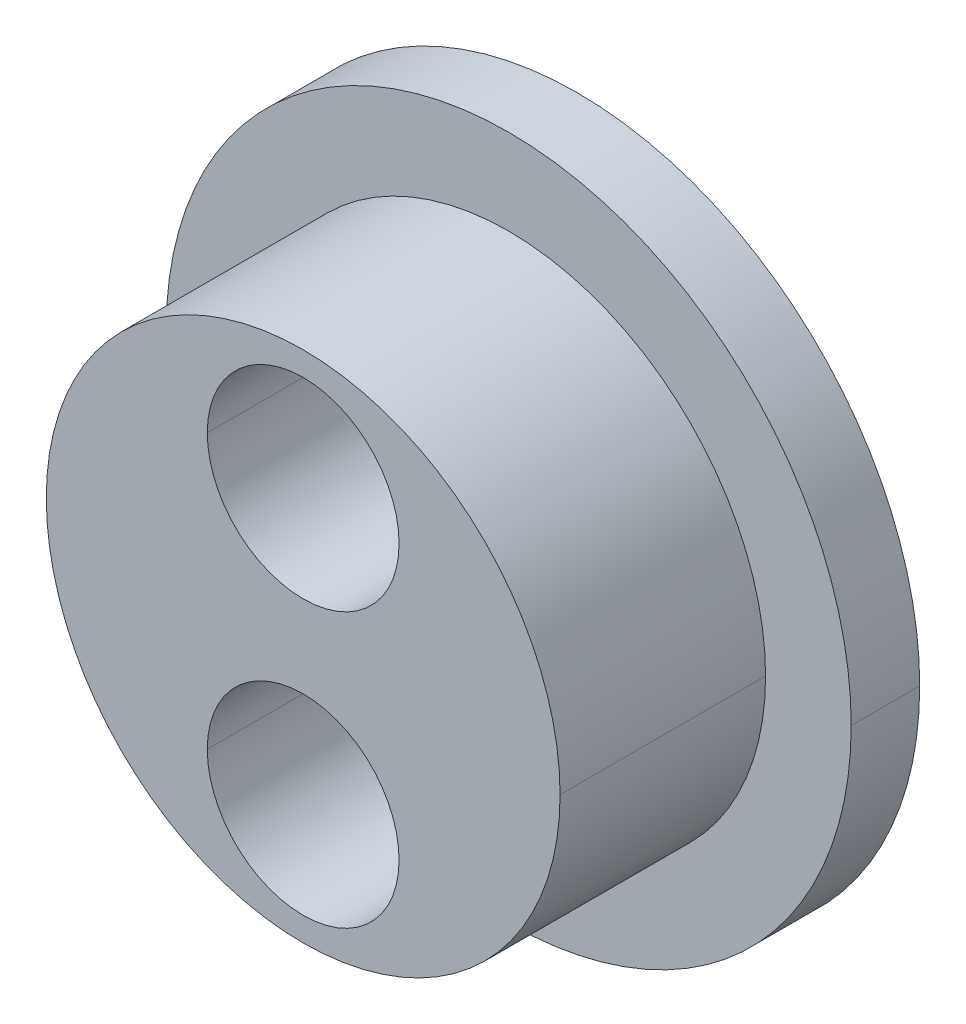
ISO-10303-21;
HEADER;
FILE_DESCRIPTION(('STEP AP214'),'2;1');
FILE_NAME('part.step','',(''),(''),'','','');
FILE_SCHEMA(('AUTOMOTIVE_DESIGN { 1 0 10303 214 1 1 1 1 }'));
ENDSEC;
DATA;
#1=APPLICATION_CONTEXT('core data for automotive mechanical design processes');
#2=APPLICATION_PROTOCOL_DEFINITION('international standard','automotive_design',2000,#1);
#3=PRODUCT_CONTEXT('',#1,'mechanical');
#4=PRODUCT('Part','Part','',(#3));
#5=PRODUCT_RELATED_PRODUCT_CATEGORY('part','',(#4));
#6=PRODUCT_DEFINITION_FORMATION('','',#4);
#7=PRODUCT_DEFINITION_CONTEXT('part definition',#1,'design');
#8=PRODUCT_DEFINITION('design','',#6,#7);
#9=PRODUCT_DEFINITION_SHAPE('','',#8);
#10=(LENGTH_UNIT() NAMED_UNIT(*) SI_UNIT(.MILLI.,.METRE.));
#11=(NAMED_UNIT(*) PLANE_ANGLE_UNIT() SI_UNIT($,.RADIAN.));
#12=(NAMED_UNIT(*) SI_UNIT($,.STERADIAN.) SOLID_ANGLE_UNIT());
#13=UNCERTAINTY_MEASURE_WITH_UNIT(LENGTH_MEASURE(1.E-05),#10,'distance_accuracy_value','');
#14=(GEOMETRIC_REPRESENTATION_CONTEXT(3) GLOBAL_UNCERTAINTY_ASSIGNED_CONTEXT((#13)) GLOBAL_UNIT_ASSIGNED_CONTEXT((#10,
#11,#12)) REPRESENTATION_CONTEXT('',''));
#15=CARTESIAN_POINT('',(0.,0.,0.));
#16=DIRECTION('',(0.,0.,1.));
#17=DIRECTION('',(1.,0.,0.));
#18=AXIS2_PLACEMENT_3D('',#15,#16,#17);
#19=CARTESIAN_POINT('',(0.,-4.,4.));
#20=DIRECTION('',(0.,0.,1.));
#21=DIRECTION('',(1.,0.,0.));
#22=AXIS2_PLACEMENT_3D('',#19,#20,#21);
#23=CYLINDRICAL_SURFACE('',#22,2.8);
#24=DIRECTION('',(0.,0.,1.));
#25=VECTOR('',#24,1.);
#26=CARTESIAN_POINT('',(-2.8,-4.,4.));
#27=LINE('',#26,#25);
#28=CARTESIAN_POINT('',(-2.8,-4.,4.));
#29=VERTEX_POINT('',#28);
#30=CARTESIAN_POINT('',(-2.8,-4.,8.));
#31=VERTEX_POINT('',#30);
#32=EDGE_CURVE('E277',#29,#31,#27,.T.);
#33=ORIENTED_EDGE('',*,*,#32,.F.);
#34=CARTESIAN_POINT('',(0.,-4.,4.));
#35=DIRECTION('',(0.,0.,1.));
#36=DIRECTION('',(1.,0.,0.));
#37=AXIS2_PLACEMENT_3D('',#34,#35,#36);
#38=CIRCLE('',#37,2.8);
#39=CARTESIAN_POINT('',(2.8,-4.,4.));
#40=VERTEX_POINT('',#39);
#41=EDGE_CURVE('E11',#40,#29,#38,.T.);
#42=ORIENTED_EDGE('',*,*,#41,.F.);
#43=DIRECTION('',(0.,0.,1.));
#44=VECTOR('',#43,1.);
#45=CARTESIAN_POINT('',(2.8,-4.,4.));
#46=LINE('',#45,#44);
#47=CARTESIAN_POINT('',(2.8,-4.,8.));
#48=VERTEX_POINT('',#47);
#49=EDGE_CURVE('E284',#40,#48,#46,.T.);
#50=ORIENTED_EDGE('',*,*,#49,.T.);
#51=CARTESIAN_POINT('',(0.,-4.,8.));
#52=DIRECTION('',(0.,0.,1.));
#53=DIRECTION('',(1.,0.,0.));
#54=AXIS2_PLACEMENT_3D('',#51,#52,#53);
#55=CIRCLE('',#54,2.8);
#56=EDGE_CURVE('E237',#48,#31,#55,.T.);
#57=ORIENTED_EDGE('',*,*,#56,.T.);
#58=EDGE_LOOP('',(#33,#42,#50,#57));
#59=FACE_BOUND('',#58,.T.);
#60=ADVANCED_FACE('F17',(#59),#23,.F.);
#61=CARTESIAN_POINT('',(0.,-4.,4.));
#62=DIRECTION('',(0.,0.,1.));
#63=DIRECTION('',(1.,0.,0.));
#64=AXIS2_PLACEMENT_3D('',#61,#62,#63);
#65=PLANE('',#64);
#66=CARTESIAN_POINT('',(0.,-4.,4.));
#67=DIRECTION('',(0.,0.,-1.));
#68=DIRECTION('',(1.,0.,0.));
#69=AXIS2_PLACEMENT_3D('',#66,#67,#68);
#70=CIRCLE('',#69,1.35);
#71=CARTESIAN_POINT('',(1.35,-4.,4.));
#72=VERTEX_POINT('',#71);
#73=CARTESIAN_POINT('',(-1.35,-4.,4.));
#74=VERTEX_POINT('',#73);
#75=EDGE_CURVE('E223',#72,#74,#70,.T.);
#76=ORIENTED_EDGE('',*,*,#75,.T.);
#77=CARTESIAN_POINT('',(0.,-4.,4.));
#78=DIRECTION('',(0.,0.,-1.));
#79=DIRECTION('',(1.,0.,0.));
#80=AXIS2_PLACEMENT_3D('',#77,#78,#79);
#81=CIRCLE('',#80,1.35);
#82=EDGE_CURVE('E38',#74,#72,#81,.T.);
#83=ORIENTED_EDGE('',*,*,#82,.T.);
#84=EDGE_LOOP('',(#76,#83));
#85=FACE_BOUND('',#84,.T.);
#86=ORIENTED_EDGE('',*,*,#41,.T.);
#87=CARTESIAN_POINT('',(0.,-4.,4.));
#88=DIRECTION('',(0.,0.,1.));
#89=DIRECTION('',(1.,0.,0.));
#90=AXIS2_PLACEMENT_3D('',#87,#88,#89);
#91=CIRCLE('',#90,2.8);
#92=EDGE_CURVE('E274',#29,#40,#91,.T.);
#93=ORIENTED_EDGE('',*,*,#92,.T.);
#94=EDGE_LOOP('',(#86,#93));
#95=FACE_BOUND('',#94,.T.);
#96=ADVANCED_FACE('F19',(#85,#95),#65,.T.);
#97=CARTESIAN_POINT('',(0.,4.,4.));
#98=DIRECTION('',(0.,0.,1.));
#99=DIRECTION('',(1.,0.,0.));
#100=AXIS2_PLACEMENT_3D('',#97,#98,#99);
#101=CYLINDRICAL_SURFACE('',#100,2.8);
#102=DIRECTION('',(0.,0.,1.));
#103=VECTOR('',#102,1.);
#104=CARTESIAN_POINT('',(-2.8,4.,4.));
#105=LINE('',#104,#103);
#106=CARTESIAN_POINT('',(-2.8,4.,4.));
#107=VERTEX_POINT('',#106);
#108=CARTESIAN_POINT('',(-2.8,4.,8.));
#109=VERTEX_POINT('',#108);
#110=EDGE_CURVE('E258',#107,#109,#105,.T.);
#111=ORIENTED_EDGE('',*,*,#110,.F.);
#112=CARTESIAN_POINT('',(0.,4.,4.));
#113=DIRECTION('',(0.,0.,1.));
#114=DIRECTION('',(1.,0.,0.));
#115=AXIS2_PLACEMENT_3D('',#112,#113,#114);
#116=CIRCLE('',#115,2.8);
#117=CARTESIAN_POINT('',(2.8,4.,4.));
#118=VERTEX_POINT('',#117);
#119=EDGE_CURVE('E26',#118,#107,#116,.T.);
#120=ORIENTED_EDGE('',*,*,#119,.F.);
#121=DIRECTION('',(0.,0.,1.));
#122=VECTOR('',#121,1.);
#123=CARTESIAN_POINT('',(2.8,4.,4.));
#124=LINE('',#123,#122);
#125=CARTESIAN_POINT('',(2.8,4.,8.));
#126=VERTEX_POINT('',#125);
#127=EDGE_CURVE('E175',#118,#126,#124,.T.);
#128=ORIENTED_EDGE('',*,*,#127,.T.);
#129=CARTESIAN_POINT('',(0.,4.,8.));
#130=DIRECTION('',(0.,0.,1.));
#131=DIRECTION('',(1.,0.,0.));
#132=AXIS2_PLACEMENT_3D('',#129,#130,#131);
#133=CIRCLE('',#132,2.8);
#134=EDGE_CURVE('E216',#126,#109,#133,.T.);
#135=ORIENTED_EDGE('',*,*,#134,.T.);
#136=EDGE_LOOP('',(#111,#120,#128,#135));
#137=FACE_BOUND('',#136,.T.);
#138=ADVANCED_FACE('F271',(#137),#101,.F.);
#139=CARTESIAN_POINT('',(0.,4.,4.));
#140=DIRECTION('',(0.,0.,1.));
#141=DIRECTION('',(1.,0.,0.));
#142=AXIS2_PLACEMENT_3D('',#139,#140,#141);
#143=PLANE('',#142);
#144=CARTESIAN_POINT('',(0.,4.,4.));
#145=DIRECTION('',(0.,0.,-1.));
#146=DIRECTION('',(1.,0.,0.));
#147=AXIS2_PLACEMENT_3D('',#144,#145,#146);
#148=CIRCLE('',#147,1.35);
#149=CARTESIAN_POINT('',(1.35,4.,4.));
#150=VERTEX_POINT('',#149);
#151=CARTESIAN_POINT('',(-1.35,4.,4.));
#152=VERTEX_POINT('',#151);
#153=EDGE_CURVE('E204',#150,#152,#148,.T.);
#154=ORIENTED_EDGE('',*,*,#153,.T.);
#155=CARTESIAN_POINT('',(0.,4.,4.));
#156=DIRECTION('',(0.,0.,-1.));
#157=DIRECTION('',(1.,0.,0.));
#158=AXIS2_PLACEMENT_3D('',#155,#156,#157);
#159=CIRCLE('',#158,1.35);
#160=EDGE_CURVE('E229',#152,#150,#159,.T.);
#161=ORIENTED_EDGE('',*,*,#160,.T.);
#162=EDGE_LOOP('',(#154,#161));
#163=FACE_BOUND('',#162,.T.);
#164=ORIENTED_EDGE('',*,*,#119,.T.);
#165=CARTESIAN_POINT('',(0.,4.,4.));
#166=DIRECTION('',(0.,0.,1.));
#167=DIRECTION('',(1.,0.,0.));
#168=AXIS2_PLACEMENT_3D('',#165,#166,#167);
#169=CIRCLE('',#168,2.8);
#170=EDGE_CURVE('E256',#107,#118,#169,.T.);
#171=ORIENTED_EDGE('',*,*,#170,.T.);
#172=EDGE_LOOP('',(#164,#171));
#173=FACE_BOUND('',#172,.T.);
#174=ADVANCED_FACE('F304',(#163,#173),#143,.T.);
#175=CARTESIAN_POINT('',(0.,0.,8.));
#176=DIRECTION('',(0.,0.,1.));
#177=DIRECTION('',(1.,0.,0.));
#178=AXIS2_PLACEMENT_3D('',#175,#176,#177);
#179=PLANE('',#178);
#180=ORIENTED_EDGE('',*,*,#56,.F.);
#181=CARTESIAN_POINT('',(0.,-4.,8.));
#182=DIRECTION('',(0.,0.,1.));
#183=DIRECTION('',(1.,0.,0.));
#184=AXIS2_PLACEMENT_3D('',#181,#182,#183);
#185=CIRCLE('',#184,2.8);
#186=EDGE_CURVE('E281',#31,#48,#185,.T.);
#187=ORIENTED_EDGE('',*,*,#186,.F.);
#188=EDGE_LOOP('',(#180,#187));
#189=FACE_BOUND('',#188,.T.);
#190=ORIENTED_EDGE('',*,*,#134,.F.);
#191=CARTESIAN_POINT('',(0.,4.,8.));
#192=DIRECTION('',(0.,0.,1.));
#193=DIRECTION('',(1.,0.,0.));
#194=AXIS2_PLACEMENT_3D('',#191,#192,#193);
#195=CIRCLE('',#194,2.8);
#196=EDGE_CURVE('E170',#109,#126,#195,.T.);
#197=ORIENTED_EDGE('',*,*,#196,.F.);
#198=EDGE_LOOP('',(#190,#197));
#199=FACE_BOUND('',#198,.T.);
#200=CARTESIAN_POINT('',(0.,0.,8.));
#201=DIRECTION('',(0.,0.,1.));
#202=DIRECTION('',(1.,0.,0.));
#203=AXIS2_PLACEMENT_3D('',#200,#201,#202);
#204=CIRCLE('',#203,7.5);
#205=CARTESIAN_POINT('',(-7.5,0.,8.));
#206=VERTEX_POINT('',#205);
#207=CARTESIAN_POINT('',(7.5,0.,8.));
#208=VERTEX_POINT('',#207);
#209=EDGE_CURVE('E213',#206,#208,#204,.T.);
#210=ORIENTED_EDGE('',*,*,#209,.T.);
#211=CARTESIAN_POINT('',(0.,0.,8.));
#212=DIRECTION('',(0.,0.,1.));
#213=DIRECTION('',(1.,0.,0.));
#214=AXIS2_PLACEMENT_3D('',#211,#212,#213);
#215=CIRCLE('',#214,7.5);
#216=EDGE_CURVE('E179',#208,#206,#215,.T.);
#217=ORIENTED_EDGE('',*,*,#216,.T.);
#218=EDGE_LOOP('',(#210,#217));
#219=FACE_BOUND('',#218,.T.);
#220=ADVANCED_FACE('F300',(#189,#199,#219),#179,.T.);
#221=CARTESIAN_POINT('',(0.,0.,8.));
#222=DIRECTION('',(0.,0.,-1.));
#223=DIRECTION('',(-1.,0.,0.));
#224=AXIS2_PLACEMENT_3D('',#221,#222,#223);
#225=CYLINDRICAL_SURFACE('',#224,7.5);
#226=DIRECTION('',(0.,0.,-1.));
#227=VECTOR('',#226,1.);
#228=CARTESIAN_POINT('',(7.5,0.,8.));
#229=LINE('',#228,#227);
#230=CARTESIAN_POINT('',(7.5,0.,2.));
#231=VERTEX_POINT('',#230);
#232=EDGE_CURVE('E186',#208,#231,#229,.T.);
#233=ORIENTED_EDGE('',*,*,#232,.F.);
#234=ORIENTED_EDGE('',*,*,#209,.F.);
#235=DIRECTION('',(0.,0.,-1.));
#236=VECTOR('',#235,1.);
#237=CARTESIAN_POINT('',(-7.5,0.,8.));
#238=LINE('',#237,#236);
#239=CARTESIAN_POINT('',(-7.5,0.,2.));
#240=VERTEX_POINT('',#239);
#241=EDGE_CURVE('E185',#206,#240,#238,.T.);
#242=ORIENTED_EDGE('',*,*,#241,.T.);
#243=CARTESIAN_POINT('',(0.,0.,2.));
#244=DIRECTION('',(0.,0.,1.));
#245=DIRECTION('',(1.,0.,0.));
#246=AXIS2_PLACEMENT_3D('',#243,#244,#245);
#247=CIRCLE('',#246,7.5);
#248=EDGE_CURVE('E145',#240,#231,#247,.T.);
#249=ORIENTED_EDGE('',*,*,#248,.T.);
#250=EDGE_LOOP('',(#233,#234,#242,#249));
#251=FACE_BOUND('',#250,.T.);
#252=ADVANCED_FACE('F303',(#251),#225,.T.);
#253=CARTESIAN_POINT('',(0.,0.,0.));
#254=DIRECTION('',(0.,0.,1.));
#255=DIRECTION('',(1.,0.,0.));
#256=AXIS2_PLACEMENT_3D('',#253,#254,#255);
#257=PLANE('',#256);
#258=CARTESIAN_POINT('',(0.,-4.,0.));
#259=DIRECTION('',(0.,0.,1.));
#260=DIRECTION('',(1.,0.,0.));
#261=AXIS2_PLACEMENT_3D('',#258,#259,#260);
#262=CIRCLE('',#261,1.35);
#263=CARTESIAN_POINT('',(1.35,-4.,0.));
#264=VERTEX_POINT('',#263);
#265=CARTESIAN_POINT('',(-1.35,-4.,0.));
#266=VERTEX_POINT('',#265);
#267=EDGE_CURVE('E172',#264,#266,#262,.T.);
#268=ORIENTED_EDGE('',*,*,#267,.T.);
#269=CARTESIAN_POINT('',(0.,-4.,0.));
#270=DIRECTION('',(0.,0.,1.));
#271=DIRECTION('',(1.,0.,0.));
#272=AXIS2_PLACEMENT_3D('',#269,#270,#271);
#273=CIRCLE('',#272,1.35);
#274=EDGE_CURVE('E212',#266,#264,#273,.T.);
#275=ORIENTED_EDGE('',*,*,#274,.T.);
#276=EDGE_LOOP('',(#268,#275));
#277=FACE_BOUND('',#276,.T.);
#278=CARTESIAN_POINT('',(0.,4.,0.));
#279=DIRECTION('',(0.,0.,1.));
#280=DIRECTION('',(1.,0.,0.));
#281=AXIS2_PLACEMENT_3D('',#278,#279,#280);
#282=CIRCLE('',#281,1.35);
#283=CARTESIAN_POINT('',(1.35,4.,0.));
#284=VERTEX_POINT('',#283);
#285=CARTESIAN_POINT('',(-1.35,4.,0.));
#286=VERTEX_POINT('',#285);
#287=EDGE_CURVE('E182',#284,#286,#282,.T.);
#288=ORIENTED_EDGE('',*,*,#287,.T.);
#289=CARTESIAN_POINT('',(0.,4.,0.));
#290=DIRECTION('',(0.,0.,1.));
#291=DIRECTION('',(1.,0.,0.));
#292=AXIS2_PLACEMENT_3D('',#289,#290,#291);
#293=CIRCLE('',#292,1.35);
#294=EDGE_CURVE('E155',#286,#284,#293,.T.);
#295=ORIENTED_EDGE('',*,*,#294,.T.);
#296=EDGE_LOOP('',(#288,#295));
#297=FACE_BOUND('',#296,.T.);
#298=CARTESIAN_POINT('',(0.,0.,0.));
#299=DIRECTION('',(0.,0.,1.));
#300=DIRECTION('',(1.,0.,0.));
#301=AXIS2_PLACEMENT_3D('',#298,#299,#300);
#302=CIRCLE('',#301,10.);
#303=CARTESIAN_POINT('',(-10.,0.,0.));
#304=VERTEX_POINT('',#303);
#305=CARTESIAN_POINT('',(10.,0.,0.));
#306=VERTEX_POINT('',#305);
#307=EDGE_CURVE('E136',#304,#306,#302,.T.);
#308=ORIENTED_EDGE('',*,*,#307,.F.);
#309=CARTESIAN_POINT('',(0.,0.,0.));
#310=DIRECTION('',(0.,0.,1.));
#311=DIRECTION('',(1.,0.,0.));
#312=AXIS2_PLACEMENT_3D('',#309,#310,#311);
#313=CIRCLE('',#312,10.);
#314=EDGE_CURVE('E140',#306,#304,#313,.T.);
#315=ORIENTED_EDGE('',*,*,#314,.F.);
#316=EDGE_LOOP('',(#308,#315));
#317=FACE_BOUND('',#316,.T.);
#318=ADVANCED_FACE('F138',(#277,#297,#317),#257,.F.);
#319=CARTESIAN_POINT('',(0.,0.,2.));
#320=DIRECTION('',(0.,0.,1.));
#321=DIRECTION('',(1.,0.,0.));
#322=AXIS2_PLACEMENT_3D('',#319,#320,#321);
#323=PLANE('',#322);
#324=ORIENTED_EDGE('',*,*,#248,.F.);
#325=CARTESIAN_POINT('',(0.,0.,2.));
#326=DIRECTION('',(0.,0.,1.));
#327=DIRECTION('',(1.,0.,0.));
#328=AXIS2_PLACEMENT_3D('',#325,#326,#327);
#329=CIRCLE('',#328,7.5);
#330=EDGE_CURVE('E190',#231,#240,#329,.T.);
#331=ORIENTED_EDGE('',*,*,#330,.F.);
#332=EDGE_LOOP('',(#324,#331));
#333=FACE_BOUND('',#332,.T.);
#334=CARTESIAN_POINT('',(0.,0.,2.));
#335=DIRECTION('',(0.,0.,1.));
#336=DIRECTION('',(1.,0.,0.));
#337=AXIS2_PLACEMENT_3D('',#334,#335,#336);
#338=CIRCLE('',#337,10.);
#339=CARTESIAN_POINT('',(-10.,0.,2.));
#340=VERTEX_POINT('',#339);
#341=CARTESIAN_POINT('',(10.,0.,2.));
#342=VERTEX_POINT('',#341);
#343=EDGE_CURVE('E146',#340,#342,#338,.T.);
#344=ORIENTED_EDGE('',*,*,#343,.T.);
#345=CARTESIAN_POINT('',(0.,0.,2.));
#346=DIRECTION('',(0.,0.,1.));
#347=DIRECTION('',(1.,0.,0.));
#348=AXIS2_PLACEMENT_3D('',#345,#346,#347);
#349=CIRCLE('',#348,10.);
#350=EDGE_CURVE('E166',#342,#340,#349,.T.);
#351=ORIENTED_EDGE('',*,*,#350,.T.);
#352=EDGE_LOOP('',(#344,#351));
#353=FACE_BOUND('',#352,.T.);
#354=ADVANCED_FACE('F316',(#333,#353),#323,.T.);
#355=CARTESIAN_POINT('',(0.,0.,2.));
#356=DIRECTION('',(0.,0.,-1.));
#357=DIRECTION('',(-1.,0.,0.));
#358=AXIS2_PLACEMENT_3D('',#355,#356,#357);
#359=CYLINDRICAL_SURFACE('',#358,10.);
#360=DIRECTION('',(0.,0.,-1.));
#361=VECTOR('',#360,1.);
#362=CARTESIAN_POINT('',(10.,0.,2.));
#363=LINE('',#362,#361);
#364=EDGE_CURVE('E158',#342,#306,#363,.T.);
#365=ORIENTED_EDGE('',*,*,#364,.F.);
#366=ORIENTED_EDGE('',*,*,#343,.F.);
#367=DIRECTION('',(0.,0.,-1.));
#368=VECTOR('',#367,1.);
#369=CARTESIAN_POINT('',(-10.,0.,2.));
#370=LINE('',#369,#368);
#371=EDGE_CURVE('E149',#340,#304,#370,.T.);
#372=ORIENTED_EDGE('',*,*,#371,.T.);
#373=ORIENTED_EDGE('',*,*,#307,.T.);
#374=EDGE_LOOP('',(#365,#366,#372,#373));
#375=FACE_BOUND('',#374,.T.);
#376=ADVANCED_FACE('F150',(#375),#359,.T.);
#377=CARTESIAN_POINT('',(0.,4.,0.));
#378=DIRECTION('',(0.,0.,1.));
#379=DIRECTION('',(1.,0.,0.));
#380=AXIS2_PLACEMENT_3D('',#377,#378,#379);
#381=CYLINDRICAL_SURFACE('',#380,1.35);
#382=DIRECTION('',(0.,0.,1.));
#383=VECTOR('',#382,1.);
#384=CARTESIAN_POINT('',(-1.35,4.,0.));
#385=LINE('',#384,#383);
#386=EDGE_CURVE('E200',#286,#152,#385,.T.);
#387=ORIENTED_EDGE('',*,*,#386,.F.);
#388=ORIENTED_EDGE('',*,*,#287,.F.);
#389=DIRECTION('',(0.,0.,1.));
#390=VECTOR('',#389,1.);
#391=CARTESIAN_POINT('',(1.35,4.,0.));
#392=LINE('',#391,#390);
#393=EDGE_CURVE('E208',#284,#150,#392,.T.);
#394=ORIENTED_EDGE('',*,*,#393,.T.);
#395=ORIENTED_EDGE('',*,*,#160,.F.);
#396=EDGE_LOOP('',(#387,#388,#394,#395));
#397=FACE_BOUND('',#396,.T.);
#398=ADVANCED_FACE('F325',(#397),#381,.F.);
#399=CARTESIAN_POINT('',(0.,-4.,0.));
#400=DIRECTION('',(0.,0.,1.));
#401=DIRECTION('',(1.,0.,0.));
#402=AXIS2_PLACEMENT_3D('',#399,#400,#401);
#403=CYLINDRICAL_SURFACE('',#402,1.35);
#404=DIRECTION('',(0.,0.,1.));
#405=VECTOR('',#404,1.);
#406=CARTESIAN_POINT('',(-1.35,-4.,0.));
#407=LINE('',#406,#405);
#408=EDGE_CURVE('E220',#266,#74,#407,.T.);
#409=ORIENTED_EDGE('',*,*,#408,.F.);
#410=ORIENTED_EDGE('',*,*,#267,.F.);
#411=DIRECTION('',(0.,0.,1.));
#412=VECTOR('',#411,1.);
#413=CARTESIAN_POINT('',(1.35,-4.,0.));
#414=LINE('',#413,#412);
#415=EDGE_CURVE('E174',#264,#72,#414,.T.);
#416=ORIENTED_EDGE('',*,*,#415,.T.);
#417=ORIENTED_EDGE('',*,*,#82,.F.);
#418=EDGE_LOOP('',(#409,#410,#416,#417));
#419=FACE_BOUND('',#418,.T.);
#420=ADVANCED_FACE('F265',(#419),#403,.F.);
#421=CARTESIAN_POINT('',(0.,-4.,0.));
#422=DIRECTION('',(0.,0.,1.));
#423=DIRECTION('',(1.,0.,0.));
#424=AXIS2_PLACEMENT_3D('',#421,#422,#423);
#425=CYLINDRICAL_SURFACE('',#424,1.35);
#426=ORIENTED_EDGE('',*,*,#274,.F.);
#427=ORIENTED_EDGE('',*,*,#408,.T.);
#428=ORIENTED_EDGE('',*,*,#75,.F.);
#429=ORIENTED_EDGE('',*,*,#415,.F.);
#430=EDGE_LOOP('',(#426,#427,#428,#429));
#431=FACE_BOUND('',#430,.T.);
#432=ADVANCED_FACE('F268',(#431),#425,.F.);
#433=CARTESIAN_POINT('',(0.,4.,0.));
#434=DIRECTION('',(0.,0.,1.));
#435=DIRECTION('',(1.,0.,0.));
#436=AXIS2_PLACEMENT_3D('',#433,#434,#435);
#437=CYLINDRICAL_SURFACE('',#436,1.35);
#438=ORIENTED_EDGE('',*,*,#294,.F.);
#439=ORIENTED_EDGE('',*,*,#386,.T.);
#440=ORIENTED_EDGE('',*,*,#153,.F.);
#441=ORIENTED_EDGE('',*,*,#393,.F.);
#442=EDGE_LOOP('',(#438,#439,#440,#441));
#443=FACE_BOUND('',#442,.T.);
#444=ADVANCED_FACE('F453',(#443),#437,.F.);
#445=CARTESIAN_POINT('',(0.,0.,2.));
#446=DIRECTION('',(0.,0.,-1.));
#447=DIRECTION('',(-1.,0.,0.));
#448=AXIS2_PLACEMENT_3D('',#445,#446,#447);
#449=CYLINDRICAL_SURFACE('',#448,10.);
#450=ORIENTED_EDGE('',*,*,#350,.F.);
#451=ORIENTED_EDGE('',*,*,#364,.T.);
#452=ORIENTED_EDGE('',*,*,#314,.T.);
#453=ORIENTED_EDGE('',*,*,#371,.F.);
#454=EDGE_LOOP('',(#450,#451,#452,#453));
#455=FACE_BOUND('',#454,.T.);
#456=ADVANCED_FACE('F157',(#455),#449,.T.);
#457=CARTESIAN_POINT('',(0.,0.,8.));
#458=DIRECTION('',(0.,0.,-1.));
#459=DIRECTION('',(-1.,0.,0.));
#460=AXIS2_PLACEMENT_3D('',#457,#458,#459);
#461=CYLINDRICAL_SURFACE('',#460,7.5);
#462=ORIENTED_EDGE('',*,*,#216,.F.);
#463=ORIENTED_EDGE('',*,*,#232,.T.);
#464=ORIENTED_EDGE('',*,*,#330,.T.);
#465=ORIENTED_EDGE('',*,*,#241,.F.);
#466=EDGE_LOOP('',(#462,#463,#464,#465));
#467=FACE_BOUND('',#466,.T.);
#468=ADVANCED_FACE('F314',(#467),#461,.T.);
#469=CARTESIAN_POINT('',(0.,4.,4.));
#470=DIRECTION('',(0.,0.,1.));
#471=DIRECTION('',(1.,0.,0.));
#472=AXIS2_PLACEMENT_3D('',#469,#470,#471);
#473=CYLINDRICAL_SURFACE('',#472,2.8);
#474=ORIENTED_EDGE('',*,*,#170,.F.);
#475=ORIENTED_EDGE('',*,*,#110,.T.);
#476=ORIENTED_EDGE('',*,*,#196,.T.);
#477=ORIENTED_EDGE('',*,*,#127,.F.);
#478=EDGE_LOOP('',(#474,#475,#476,#477));
#479=FACE_BOUND('',#478,.T.);
#480=ADVANCED_FACE('F349',(#479),#473,.F.);
#481=CARTESIAN_POINT('',(0.,-4.,4.));
#482=DIRECTION('',(0.,0.,1.));
#483=DIRECTION('',(1.,0.,0.));
#484=AXIS2_PLACEMENT_3D('',#481,#482,#483);
#485=CYLINDRICAL_SURFACE('',#484,2.8);
#486=ORIENTED_EDGE('',*,*,#92,.F.);
#487=ORIENTED_EDGE('',*,*,#32,.T.);
#488=ORIENTED_EDGE('',*,*,#186,.T.);
#489=ORIENTED_EDGE('',*,*,#49,.F.);
#490=EDGE_LOOP('',(#486,#487,#488,#489));
#491=FACE_BOUND('',#490,.T.);
#492=ADVANCED_FACE('F283',(#491),#485,.F.);
#493=CLOSED_SHELL('',(#60,#96,#138,#174,#220,#252,#318,#354,#376,#398,#420,#432,#444,#456,#468,
#480,#492));
#494=MANIFOLD_SOLID_BREP('B1',#493);
#495=ADVANCED_BREP_SHAPE_REPRESENTATION('',(#18,#494),#14);
#496=SHAPE_DEFINITION_REPRESENTATION(#9,#495);
ENDSEC;
END-ISO-10303-21;
